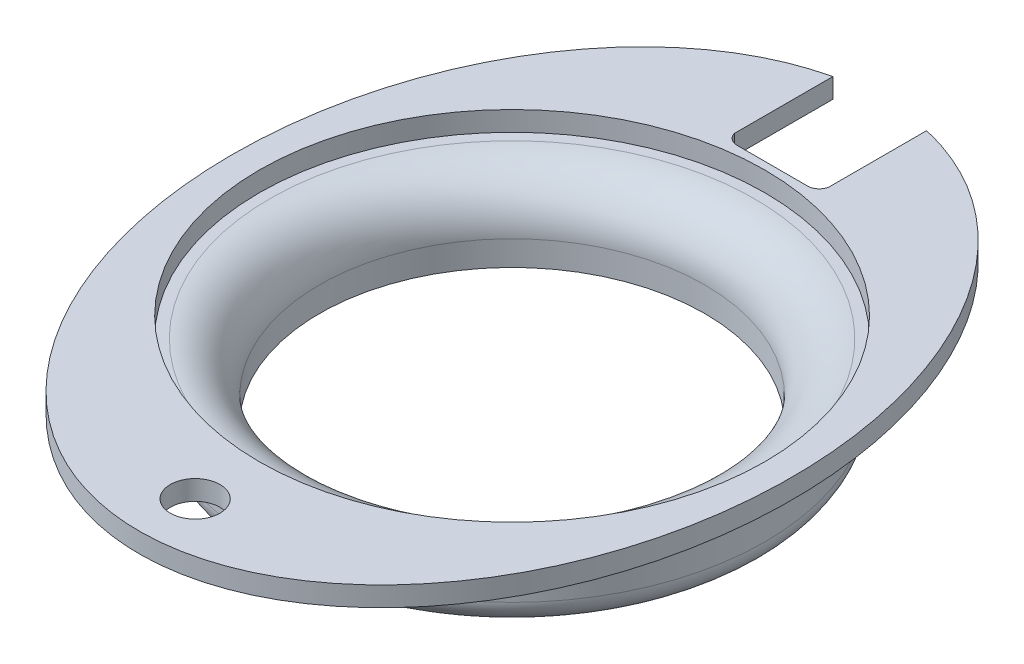
ISO-10303-21;
HEADER;
FILE_DESCRIPTION(('STEP AP214'),'2;1');
FILE_NAME('part.step','',(''),(''),'','','');
FILE_SCHEMA(('AUTOMOTIVE_DESIGN { 1 0 10303 214 1 1 1 1 }'));
ENDSEC;
DATA;
#1=APPLICATION_CONTEXT('core data for automotive mechanical design processes');
#2=APPLICATION_PROTOCOL_DEFINITION('international standard','automotive_design',2000,#1);
#3=PRODUCT_CONTEXT('',#1,'mechanical');
#4=PRODUCT('Part','Part','',(#3));
#5=PRODUCT_RELATED_PRODUCT_CATEGORY('part','',(#4));
#6=PRODUCT_DEFINITION_FORMATION('','',#4);
#7=PRODUCT_DEFINITION_CONTEXT('part definition',#1,'design');
#8=PRODUCT_DEFINITION('design','',#6,#7);
#9=PRODUCT_DEFINITION_SHAPE('','',#8);
#10=(LENGTH_UNIT() NAMED_UNIT(*) SI_UNIT(.MILLI.,.METRE.));
#11=(NAMED_UNIT(*) PLANE_ANGLE_UNIT() SI_UNIT($,.RADIAN.));
#12=(NAMED_UNIT(*) SI_UNIT($,.STERADIAN.) SOLID_ANGLE_UNIT());
#13=UNCERTAINTY_MEASURE_WITH_UNIT(LENGTH_MEASURE(1.E-05),#10,'distance_accuracy_value','');
#14=(GEOMETRIC_REPRESENTATION_CONTEXT(3) GLOBAL_UNCERTAINTY_ASSIGNED_CONTEXT((#13)) GLOBAL_UNIT_ASSIGNED_CONTEXT((#10,
#11,#12)) REPRESENTATION_CONTEXT('',''));
#15=CARTESIAN_POINT('',(0.,0.,0.));
#16=DIRECTION('',(0.,0.,1.));
#17=DIRECTION('',(1.,0.,0.));
#18=AXIS2_PLACEMENT_3D('',#15,#16,#17);
#19=CARTESIAN_POINT('',(0.,-6.,0.));
#20=DIRECTION('',(0.,1.,0.));
#21=DIRECTION('',(0.,0.,1.));
#22=AXIS2_PLACEMENT_3D('',#19,#20,#21);
#23=CYLINDRICAL_SURFACE('',#22,20.335);
#24=CARTESIAN_POINT('',(0.,-4.,0.));
#25=DIRECTION('',(0.,1.,0.));
#26=DIRECTION('',(0.,0.,1.));
#27=AXIS2_PLACEMENT_3D('',#24,#25,#26);
#28=CIRCLE('',#27,20.335);
#29=CARTESIAN_POINT('',(0.,-4.,20.335));
#30=VERTEX_POINT('',#29);
#31=EDGE_CURVE('E61',#30,#30,#28,.T.);
#32=ORIENTED_EDGE('',*,*,#31,.T.);
#33=EDGE_LOOP('',(#32));
#34=FACE_BOUND('',#33,.T.);
#35=CARTESIAN_POINT('',(0.,0.,0.));
#36=DIRECTION('',(0.,1.,0.));
#37=DIRECTION('',(0.,0.,1.));
#38=AXIS2_PLACEMENT_3D('',#35,#36,#37);
#39=CIRCLE('',#38,20.335);
#40=CARTESIAN_POINT('',(0.,0.,20.335));
#41=VERTEX_POINT('',#40);
#42=EDGE_CURVE('E77',#41,#41,#39,.T.);
#43=ORIENTED_EDGE('',*,*,#42,.F.);
#44=EDGE_LOOP('',(#43));
#45=FACE_BOUND('',#44,.T.);
#46=ADVANCED_FACE('F53',(#34,#45),#23,.T.);
#47=CARTESIAN_POINT('',(0.,-6.,0.));
#48=DIRECTION('',(0.,1.,0.));
#49=DIRECTION('',(0.,0.,1.));
#50=AXIS2_PLACEMENT_3D('',#47,#48,#49);
#51=PLANE('',#50);
#52=CARTESIAN_POINT('',(0.,-6.,0.));
#53=DIRECTION('',(0.,1.,0.));
#54=DIRECTION('',(0.,0.,1.));
#55=AXIS2_PLACEMENT_3D('',#52,#53,#54);
#56=CIRCLE('',#55,18.335);
#57=CARTESIAN_POINT('',(0.,-6.,18.335));
#58=VERTEX_POINT('',#57);
#59=EDGE_CURVE('E11',#58,#58,#56,.F.);
#60=ORIENTED_EDGE('',*,*,#59,.T.);
#61=EDGE_LOOP('',(#60));
#62=FACE_BOUND('',#61,.T.);
#63=CARTESIAN_POINT('',(0.,-6.,0.));
#64=DIRECTION('',(0.,1.,0.));
#65=DIRECTION('',(0.,0.,1.));
#66=AXIS2_PLACEMENT_3D('',#63,#64,#65);
#67=CIRCLE('',#66,15.5);
#68=CARTESIAN_POINT('',(0.,-6.,15.5));
#69=VERTEX_POINT('',#68);
#70=EDGE_CURVE('E81',#69,#69,#67,.T.);
#71=ORIENTED_EDGE('',*,*,#70,.T.);
#72=EDGE_LOOP('',(#71));
#73=FACE_BOUND('',#72,.T.);
#74=ADVANCED_FACE('F86',(#62,#73),#51,.F.);
#75=CARTESIAN_POINT('',(0.,0.,0.));
#76=DIRECTION('',(0.,1.,0.));
#77=DIRECTION('',(0.,0.,1.));
#78=AXIS2_PLACEMENT_3D('',#75,#76,#77);
#79=PLANE('',#78);
#80=CARTESIAN_POINT('',(0.,0.,0.));
#81=DIRECTION('',(0.,1.,0.));
#82=DIRECTION('',(0.,0.,1.));
#83=AXIS2_PLACEMENT_3D('',#80,#81,#82);
#84=CIRCLE('',#83,19.5);
#85=CARTESIAN_POINT('',(0.,0.,19.5));
#86=VERTEX_POINT('',#85);
#87=EDGE_CURVE('E66',#86,#86,#84,.F.);
#88=ORIENTED_EDGE('',*,*,#87,.T.);
#89=EDGE_LOOP('',(#88));
#90=FACE_BOUND('',#89,.T.);
#91=ORIENTED_EDGE('',*,*,#42,.T.);
#92=EDGE_LOOP('',(#91));
#93=FACE_BOUND('',#92,.T.);
#94=ADVANCED_FACE('F91',(#90,#93),#79,.T.);
#95=CARTESIAN_POINT('',(0.,-6.,0.));
#96=DIRECTION('',(0.,1.,0.));
#97=DIRECTION('',(0.,0.,1.));
#98=AXIS2_PLACEMENT_3D('',#95,#96,#97);
#99=CYLINDRICAL_SURFACE('',#98,15.5);
#100=CARTESIAN_POINT('',(0.,-4.,0.));
#101=DIRECTION('',(0.,1.,0.));
#102=DIRECTION('',(0.,0.,1.));
#103=AXIS2_PLACEMENT_3D('',#100,#101,#102);
#104=CIRCLE('',#103,15.5);
#105=CARTESIAN_POINT('',(0.,-4.,15.5));
#106=VERTEX_POINT('',#105);
#107=EDGE_CURVE('E71',#106,#106,#104,.T.);
#108=ORIENTED_EDGE('',*,*,#107,.T.);
#109=EDGE_LOOP('',(#108));
#110=FACE_BOUND('',#109,.T.);
#111=ORIENTED_EDGE('',*,*,#70,.F.);
#112=EDGE_LOOP('',(#111));
#113=FACE_BOUND('',#112,.T.);
#114=ADVANCED_FACE('F88',(#110,#113),#99,.F.);
#115=CARTESIAN_POINT('',(0.,-4.,0.));
#116=DIRECTION('',(0.,1.,0.));
#117=DIRECTION('',(0.,0.,1.));
#118=AXIS2_PLACEMENT_3D('',#115,#116,#117);
#119=TOROIDAL_SURFACE('',#118,19.5,4.);
#120=ORIENTED_EDGE('',*,*,#87,.F.);
#121=EDGE_LOOP('',(#120));
#122=FACE_BOUND('',#121,.T.);
#123=ORIENTED_EDGE('',*,*,#107,.F.);
#124=EDGE_LOOP('',(#123));
#125=FACE_BOUND('',#124,.T.);
#126=ADVANCED_FACE('F90',(#122,#125),#119,.T.);
#127=CARTESIAN_POINT('',(0.,-4.,0.));
#128=DIRECTION('',(0.,1.,0.));
#129=DIRECTION('',(0.,0.,1.));
#130=AXIS2_PLACEMENT_3D('',#127,#128,#129);
#131=TOROIDAL_SURFACE('',#130,18.335,2.);
#132=ORIENTED_EDGE('',*,*,#59,.F.);
#133=EDGE_LOOP('',(#132));
#134=FACE_BOUND('',#133,.T.);
#135=ORIENTED_EDGE('',*,*,#31,.F.);
#136=EDGE_LOOP('',(#135));
#137=FACE_BOUND('',#136,.T.);
#138=ADVANCED_FACE('F55',(#134,#137),#131,.T.);
#139=CLOSED_SHELL('',(#46,#74,#94,#114,#126,#138));
#140=MANIFOLD_SOLID_BREP('B2',#139);
#141=CARTESIAN_POINT('',(-3.77113801553453,1.5875,0.));
#142=DIRECTION('',(1.,0.,0.));
#143=DIRECTION('',(0.,0.,-1.));
#144=AXIS2_PLACEMENT_3D('',#141,#142,#143);
#145=PLANE('',#144);
#146=DIRECTION('',(0.,0.,1.));
#147=VECTOR('',#146,1.);
#148=CARTESIAN_POINT('',(-3.77113801553453,0.,0.));
#149=LINE('',#148,#147);
#150=CARTESIAN_POINT('',(-3.77113801553453,0.,-29.5756211338638));
#151=VERTEX_POINT('',#150);
#152=CARTESIAN_POINT('',(-3.77113801553453,0.,-21.675595911068));
#153=VERTEX_POINT('',#152);
#154=EDGE_CURVE('E249',#151,#153,#149,.T.);
#155=ORIENTED_EDGE('',*,*,#154,.F.);
#156=DIRECTION('',(0.,-1.,0.));
#157=VECTOR('',#156,1.);
#158=CARTESIAN_POINT('',(-3.77113801553453,1.5875,-29.5756211338638));
#159=LINE('',#158,#157);
#160=CARTESIAN_POINT('',(-3.77113801553453,1.5875,-29.5756211338638));
#161=VERTEX_POINT('',#160);
#162=EDGE_CURVE('E51',#161,#151,#159,.T.);
#163=ORIENTED_EDGE('',*,*,#162,.F.);
#164=DIRECTION('',(0.,0.,1.));
#165=VECTOR('',#164,1.);
#166=CARTESIAN_POINT('',(-3.77113801553453,1.5875,0.));
#167=LINE('',#166,#165);
#168=CARTESIAN_POINT('',(-3.77113801553453,1.5875,-21.675595911068));
#169=VERTEX_POINT('',#168);
#170=EDGE_CURVE('E288',#161,#169,#167,.T.);
#171=ORIENTED_EDGE('',*,*,#170,.T.);
#172=DIRECTION('',(0.,-1.,0.));
#173=VECTOR('',#172,1.);
#174=CARTESIAN_POINT('',(-3.77113801553453,1.5875,-21.675595911068));
#175=LINE('',#174,#173);
#176=EDGE_CURVE('E209',#169,#153,#175,.T.);
#177=ORIENTED_EDGE('',*,*,#176,.T.);
#178=EDGE_LOOP('',(#155,#163,#171,#177));
#179=FACE_BOUND('',#178,.T.);
#180=ADVANCED_FACE('F163',(#179),#145,.T.);
#181=CARTESIAN_POINT('',(0.,1.5875,0.));
#182=DIRECTION('',(0.,1.,0.));
#183=DIRECTION('',(0.,0.,1.));
#184=AXIS2_PLACEMENT_3D('',#181,#182,#183);
#185=ELLIPSE('',#184,30.,22.5);
#186=DIRECTION('',(0.,-1.,0.));
#187=VECTOR('',#186,1.);
#188=SURFACE_OF_LINEAR_EXTRUSION('',#185,#187);
#189=CARTESIAN_POINT('',(0.,0.,0.));
#190=DIRECTION('',(0.,1.,0.));
#191=DIRECTION('',(0.,0.,1.));
#192=AXIS2_PLACEMENT_3D('',#189,#190,#191);
#193=ELLIPSE('',#192,30.,22.5);
#194=CARTESIAN_POINT('',(3.77113801553453,0.,-29.5756211338638));
#195=VERTEX_POINT('',#194);
#196=EDGE_CURVE('E253',#151,#195,#193,.T.);
#197=ORIENTED_EDGE('',*,*,#196,.T.);
#198=DIRECTION('',(0.,-1.,0.));
#199=VECTOR('',#198,1.);
#200=CARTESIAN_POINT('',(3.77113801553453,1.5875,-29.5756211338638));
#201=LINE('',#200,#199);
#202=CARTESIAN_POINT('',(3.77113801553453,1.5875,-29.5756211338638));
#203=VERTEX_POINT('',#202);
#204=EDGE_CURVE('E173',#203,#195,#201,.T.);
#205=ORIENTED_EDGE('',*,*,#204,.F.);
#206=EDGE_CURVE('E285',#161,#203,#185,.T.);
#207=ORIENTED_EDGE('',*,*,#206,.F.);
#208=ORIENTED_EDGE('',*,*,#162,.T.);
#209=EDGE_LOOP('',(#197,#205,#207,#208));
#210=FACE_BOUND('',#209,.T.);
#211=ADVANCED_FACE('F274',(#210),#188,.F.);
#212=CARTESIAN_POINT('',(3.77113801553453,1.5875,0.));
#213=DIRECTION('',(1.,0.,0.));
#214=DIRECTION('',(0.,0.,-1.));
#215=AXIS2_PLACEMENT_3D('',#212,#213,#214);
#216=PLANE('',#215);
#217=DIRECTION('',(0.,0.,1.));
#218=VECTOR('',#217,1.);
#219=CARTESIAN_POINT('',(3.77113801553453,0.,0.));
#220=LINE('',#219,#218);
#221=CARTESIAN_POINT('',(3.77113801553453,0.,-21.6755959110681));
#222=VERTEX_POINT('',#221);
#223=EDGE_CURVE('E256',#195,#222,#220,.T.);
#224=ORIENTED_EDGE('',*,*,#223,.T.);
#225=DIRECTION('',(0.,-1.,0.));
#226=VECTOR('',#225,1.);
#227=CARTESIAN_POINT('',(3.77113801553453,1.5875,-21.6755959110681));
#228=LINE('',#227,#226);
#229=CARTESIAN_POINT('',(3.77113801553453,1.5875,-21.6755959110681));
#230=VERTEX_POINT('',#229);
#231=EDGE_CURVE('E233',#230,#222,#228,.T.);
#232=ORIENTED_EDGE('',*,*,#231,.F.);
#233=DIRECTION('',(0.,0.,1.));
#234=VECTOR('',#233,1.);
#235=CARTESIAN_POINT('',(3.77113801553453,1.5875,0.));
#236=LINE('',#235,#234);
#237=EDGE_CURVE('E238',#203,#230,#236,.T.);
#238=ORIENTED_EDGE('',*,*,#237,.F.);
#239=ORIENTED_EDGE('',*,*,#204,.T.);
#240=EDGE_LOOP('',(#224,#232,#238,#239));
#241=FACE_BOUND('',#240,.T.);
#242=ADVANCED_FACE('F271',(#241),#216,.F.);
#243=CARTESIAN_POINT('',(2.83596591607907,1.5875,-21.892489273635));
#244=DIRECTION('',(0.,-1.,0.));
#245=DIRECTION('',(0.,0.,-1.));
#246=AXIS2_PLACEMENT_3D('',#243,#244,#245);
#247=CYLINDRICAL_SURFACE('',#246,0.959994576195902);
#248=CARTESIAN_POINT('',(2.83596591607907,0.,-21.892489273635));
#249=DIRECTION('',(0.,1.,0.));
#250=DIRECTION('',(0.,0.,1.));
#251=AXIS2_PLACEMENT_3D('',#248,#249,#250);
#252=CIRCLE('',#251,0.959994576195902);
#253=CARTESIAN_POINT('',(2.83596591607907,0.,-20.9324946974391));
#254=VERTEX_POINT('',#253);
#255=EDGE_CURVE('E228',#254,#222,#252,.T.);
#256=ORIENTED_EDGE('',*,*,#255,.F.);
#257=DIRECTION('',(0.,-1.,0.));
#258=VECTOR('',#257,1.);
#259=CARTESIAN_POINT('',(2.83596591607907,1.5875,-20.9324946974391));
#260=LINE('',#259,#258);
#261=CARTESIAN_POINT('',(2.83596591607907,1.5875,-20.9324946974391));
#262=VERTEX_POINT('',#261);
#263=EDGE_CURVE('E223',#262,#254,#260,.T.);
#264=ORIENTED_EDGE('',*,*,#263,.F.);
#265=CARTESIAN_POINT('',(2.83596591607907,1.5875,-21.892489273635));
#266=DIRECTION('',(0.,1.,0.));
#267=DIRECTION('',(0.,0.,1.));
#268=AXIS2_PLACEMENT_3D('',#265,#266,#267);
#269=CIRCLE('',#268,0.959994576195902);
#270=EDGE_CURVE('E226',#262,#230,#269,.T.);
#271=ORIENTED_EDGE('',*,*,#270,.T.);
#272=ORIENTED_EDGE('',*,*,#231,.T.);
#273=EDGE_LOOP('',(#256,#264,#271,#272));
#274=FACE_BOUND('',#273,.T.);
#275=ADVANCED_FACE('F225',(#274),#247,.F.);
#276=CARTESIAN_POINT('',(0.,1.5875,-20.9324946974391));
#277=DIRECTION('',(0.,0.,-1.));
#278=DIRECTION('',(-1.,0.,0.));
#279=AXIS2_PLACEMENT_3D('',#276,#277,#278);
#280=PLANE('',#279);
#281=DIRECTION('',(1.,0.,0.));
#282=VECTOR('',#281,1.);
#283=CARTESIAN_POINT('',(0.,0.,-20.9324946974391));
#284=LINE('',#283,#282);
#285=CARTESIAN_POINT('',(-2.83596591607907,0.,-20.9324946974391));
#286=VERTEX_POINT('',#285);
#287=EDGE_CURVE('E260',#286,#254,#284,.T.);
#288=ORIENTED_EDGE('',*,*,#287,.F.);
#289=DIRECTION('',(0.,-1.,0.));
#290=VECTOR('',#289,1.);
#291=CARTESIAN_POINT('',(-2.83596591607907,1.5875,-20.9324946974391));
#292=LINE('',#291,#290);
#293=CARTESIAN_POINT('',(-2.83596591607907,1.5875,-20.9324946974391));
#294=VERTEX_POINT('',#293);
#295=EDGE_CURVE('E202',#294,#286,#292,.T.);
#296=ORIENTED_EDGE('',*,*,#295,.F.);
#297=DIRECTION('',(1.,0.,0.));
#298=VECTOR('',#297,1.);
#299=CARTESIAN_POINT('',(0.,1.5875,-20.9324946974391));
#300=LINE('',#299,#298);
#301=EDGE_CURVE('E236',#294,#262,#300,.T.);
#302=ORIENTED_EDGE('',*,*,#301,.T.);
#303=ORIENTED_EDGE('',*,*,#263,.T.);
#304=EDGE_LOOP('',(#288,#296,#302,#303));
#305=FACE_BOUND('',#304,.T.);
#306=ADVANCED_FACE('F241',(#305),#280,.T.);
#307=CARTESIAN_POINT('',(0.,1.5875,0.));
#308=DIRECTION('',(0.,-1.,0.));
#309=DIRECTION('',(0.,0.,-1.));
#310=AXIS2_PLACEMENT_3D('',#307,#308,#309);
#311=CYLINDRICAL_SURFACE('',#310,20.335);
#312=CARTESIAN_POINT('',(0.,1.5875,0.));
#313=DIRECTION('',(0.,1.,0.));
#314=DIRECTION('',(0.,0.,1.));
#315=AXIS2_PLACEMENT_3D('',#312,#313,#314);
#316=CIRCLE('',#315,20.335);
#317=CARTESIAN_POINT('',(0.,1.5875,20.335));
#318=VERTEX_POINT('',#317);
#319=EDGE_CURVE('E264',#318,#318,#316,.T.);
#320=ORIENTED_EDGE('',*,*,#319,.T.);
#321=EDGE_LOOP('',(#320));
#322=FACE_BOUND('',#321,.T.);
#323=CARTESIAN_POINT('',(0.,0.,0.));
#324=DIRECTION('',(0.,1.,0.));
#325=DIRECTION('',(0.,0.,1.));
#326=AXIS2_PLACEMENT_3D('',#323,#324,#325);
#327=CIRCLE('',#326,20.335);
#328=CARTESIAN_POINT('',(0.,0.,20.335));
#329=VERTEX_POINT('',#328);
#330=EDGE_CURVE('E246',#329,#329,#327,.T.);
#331=ORIENTED_EDGE('',*,*,#330,.F.);
#332=EDGE_LOOP('',(#331));
#333=FACE_BOUND('',#332,.T.);
#334=ADVANCED_FACE('F165',(#322,#333),#311,.F.);
#335=CARTESIAN_POINT('',(-2.83596591607907,1.5875,-21.892489273635));
#336=DIRECTION('',(0.,-1.,0.));
#337=DIRECTION('',(0.,0.,-1.));
#338=AXIS2_PLACEMENT_3D('',#335,#336,#337);
#339=CYLINDRICAL_SURFACE('',#338,0.959994576195901);
#340=CARTESIAN_POINT('',(-2.83596591607907,0.,-21.892489273635));
#341=DIRECTION('',(0.,1.,0.));
#342=DIRECTION('',(0.,0.,1.));
#343=AXIS2_PLACEMENT_3D('',#340,#341,#342);
#344=CIRCLE('',#343,0.959994576195901);
#345=EDGE_CURVE('E262',#286,#153,#344,.F.);
#346=ORIENTED_EDGE('',*,*,#345,.T.);
#347=ORIENTED_EDGE('',*,*,#176,.F.);
#348=CARTESIAN_POINT('',(-2.83596591607907,1.5875,-21.892489273635));
#349=DIRECTION('',(0.,1.,0.));
#350=DIRECTION('',(0.,0.,1.));
#351=AXIS2_PLACEMENT_3D('',#348,#349,#350);
#352=CIRCLE('',#351,0.959994576195901);
#353=EDGE_CURVE('E181',#294,#169,#352,.F.);
#354=ORIENTED_EDGE('',*,*,#353,.F.);
#355=ORIENTED_EDGE('',*,*,#295,.T.);
#356=EDGE_LOOP('',(#346,#347,#354,#355));
#357=FACE_BOUND('',#356,.T.);
#358=ADVANCED_FACE('F309',(#357),#339,.F.);
#359=CARTESIAN_POINT('',(0.,1.5875,0.));
#360=DIRECTION('',(0.,1.,0.));
#361=DIRECTION('',(0.,0.,1.));
#362=AXIS2_PLACEMENT_3D('',#359,#360,#361);
#363=PLANE('',#362);
#364=CARTESIAN_POINT('',(0.,1.5875,25.5));
#365=DIRECTION('',(0.,1.,0.));
#366=DIRECTION('',(0.,0.,1.));
#367=AXIS2_PLACEMENT_3D('',#364,#365,#366);
#368=CIRCLE('',#367,2.);
#369=CARTESIAN_POINT('',(0.,1.5875,27.5));
#370=VERTEX_POINT('',#369);
#371=EDGE_CURVE('E250',#370,#370,#368,.T.);
#372=ORIENTED_EDGE('',*,*,#371,.F.);
#373=EDGE_LOOP('',(#372));
#374=FACE_BOUND('',#373,.T.);
#375=ORIENTED_EDGE('',*,*,#319,.F.);
#376=EDGE_LOOP('',(#375));
#377=FACE_BOUND('',#376,.T.);
#378=ORIENTED_EDGE('',*,*,#170,.F.);
#379=ORIENTED_EDGE('',*,*,#206,.T.);
#380=ORIENTED_EDGE('',*,*,#237,.T.);
#381=ORIENTED_EDGE('',*,*,#270,.F.);
#382=ORIENTED_EDGE('',*,*,#301,.F.);
#383=ORIENTED_EDGE('',*,*,#353,.T.);
#384=EDGE_LOOP('',(#378,#379,#380,#381,#382,#383));
#385=FACE_BOUND('',#384,.T.);
#386=ADVANCED_FACE('F235',(#374,#377,#385),#363,.T.);
#387=CARTESIAN_POINT('',(0.,0.,0.));
#388=DIRECTION('',(0.,1.,0.));
#389=DIRECTION('',(0.,0.,1.));
#390=AXIS2_PLACEMENT_3D('',#387,#388,#389);
#391=PLANE('',#390);
#392=CARTESIAN_POINT('',(0.,0.,25.5));
#393=DIRECTION('',(0.,1.,0.));
#394=DIRECTION('',(0.,0.,1.));
#395=AXIS2_PLACEMENT_3D('',#392,#393,#394);
#396=CIRCLE('',#395,2.);
#397=CARTESIAN_POINT('',(0.,0.,27.5));
#398=VERTEX_POINT('',#397);
#399=EDGE_CURVE('E167',#398,#398,#396,.T.);
#400=ORIENTED_EDGE('',*,*,#399,.T.);
#401=EDGE_LOOP('',(#400));
#402=FACE_BOUND('',#401,.T.);
#403=ORIENTED_EDGE('',*,*,#330,.T.);
#404=EDGE_LOOP('',(#403));
#405=FACE_BOUND('',#404,.T.);
#406=ORIENTED_EDGE('',*,*,#154,.T.);
#407=ORIENTED_EDGE('',*,*,#345,.F.);
#408=ORIENTED_EDGE('',*,*,#287,.T.);
#409=ORIENTED_EDGE('',*,*,#255,.T.);
#410=ORIENTED_EDGE('',*,*,#223,.F.);
#411=ORIENTED_EDGE('',*,*,#196,.F.);
#412=EDGE_LOOP('',(#406,#407,#408,#409,#410,#411));
#413=FACE_BOUND('',#412,.T.);
#414=ADVANCED_FACE('F276',(#402,#405,#413),#391,.F.);
#415=CARTESIAN_POINT('',(0.,-6.,25.5));
#416=DIRECTION('',(0.,1.,0.));
#417=DIRECTION('',(0.,0.,1.));
#418=AXIS2_PLACEMENT_3D('',#415,#416,#417);
#419=CYLINDRICAL_SURFACE('',#418,2.);
#420=ORIENTED_EDGE('',*,*,#371,.T.);
#421=EDGE_LOOP('',(#420));
#422=FACE_BOUND('',#421,.T.);
#423=ORIENTED_EDGE('',*,*,#399,.F.);
#424=EDGE_LOOP('',(#423));
#425=FACE_BOUND('',#424,.T.);
#426=ADVANCED_FACE('F300',(#422,#425),#419,.F.);
#427=CLOSED_SHELL('',(#180,#211,#242,#275,#306,#334,#358,#386,#414,#426));
#428=MANIFOLD_SOLID_BREP('B6',#427);
#429=ADVANCED_BREP_SHAPE_REPRESENTATION('',(#18,#140,#428),#14);
#430=SHAPE_DEFINITION_REPRESENTATION(#9,#429);
ENDSEC;
END-ISO-10303-21;
